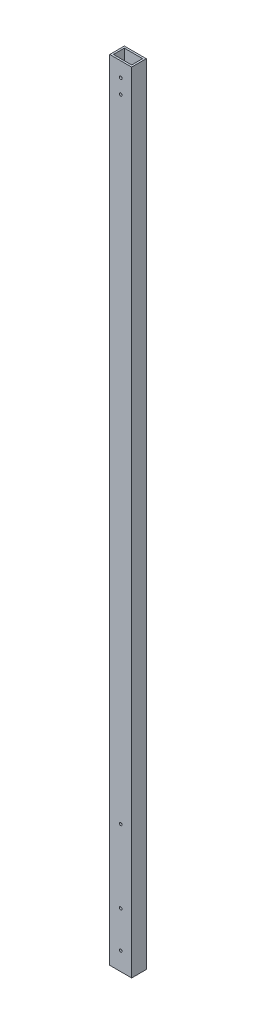
ISO-10303-21;
HEADER;
FILE_DESCRIPTION(('STEP AP214'),'2;1');
FILE_NAME('part.step','',(''),(''),'','','');
FILE_SCHEMA(('AUTOMOTIVE_DESIGN { 1 0 10303 214 1 1 1 1 }'));
ENDSEC;
DATA;
#1=APPLICATION_CONTEXT('core data for automotive mechanical design processes');
#2=APPLICATION_PROTOCOL_DEFINITION('international standard','automotive_design',2000,#1);
#3=PRODUCT_CONTEXT('',#1,'mechanical');
#4=PRODUCT('Part','Part','',(#3));
#5=PRODUCT_RELATED_PRODUCT_CATEGORY('part','',(#4));
#6=PRODUCT_DEFINITION_FORMATION('','',#4);
#7=PRODUCT_DEFINITION_CONTEXT('part definition',#1,'design');
#8=PRODUCT_DEFINITION('design','',#6,#7);
#9=PRODUCT_DEFINITION_SHAPE('','',#8);
#10=(LENGTH_UNIT() NAMED_UNIT(*) SI_UNIT(.MILLI.,.METRE.));
#11=(NAMED_UNIT(*) PLANE_ANGLE_UNIT() SI_UNIT($,.RADIAN.));
#12=(NAMED_UNIT(*) SI_UNIT($,.STERADIAN.) SOLID_ANGLE_UNIT());
#13=UNCERTAINTY_MEASURE_WITH_UNIT(LENGTH_MEASURE(1.E-05),#10,'distance_accuracy_value','');
#14=(GEOMETRIC_REPRESENTATION_CONTEXT(3) GLOBAL_UNCERTAINTY_ASSIGNED_CONTEXT((#13)) GLOBAL_UNIT_ASSIGNED_CONTEXT((#10,
#11,#12)) REPRESENTATION_CONTEXT('',''));
#15=CARTESIAN_POINT('',(0.,0.,0.));
#16=DIRECTION('',(0.,0.,1.));
#17=DIRECTION('',(1.,0.,0.));
#18=AXIS2_PLACEMENT_3D('',#15,#16,#17);
#19=CARTESIAN_POINT('',(0.,1371.6,0.));
#20=DIRECTION('',(0.,-1.,0.));
#21=DIRECTION('',(0.,0.,-1.));
#22=AXIS2_PLACEMENT_3D('',#19,#20,#21);
#23=PLANE('',#22);
#24=DIRECTION('',(0.,0.,-1.));
#25=VECTOR('',#24,1.);
#26=CARTESIAN_POINT('',(19.05,1371.6,12.7));
#27=LINE('',#26,#25);
#28=CARTESIAN_POINT('',(19.05,1371.6,12.7));
#29=VERTEX_POINT('',#28);
#30=CARTESIAN_POINT('',(19.05,1371.6,-12.7));
#31=VERTEX_POINT('',#30);
#32=EDGE_CURVE('E146',#29,#31,#27,.T.);
#33=ORIENTED_EDGE('',*,*,#32,.T.);
#34=DIRECTION('',(-1.,0.,0.));
#35=VECTOR('',#34,1.);
#36=CARTESIAN_POINT('',(-19.05,1371.6,-12.7));
#37=LINE('',#36,#35);
#38=CARTESIAN_POINT('',(-19.05,1371.6,-12.7));
#39=VERTEX_POINT('',#38);
#40=EDGE_CURVE('E149',#31,#39,#37,.T.);
#41=ORIENTED_EDGE('',*,*,#40,.T.);
#42=DIRECTION('',(0.,0.,1.));
#43=VECTOR('',#42,1.);
#44=CARTESIAN_POINT('',(-19.05,1371.6,12.7));
#45=LINE('',#44,#43);
#46=CARTESIAN_POINT('',(-19.05,1371.6,12.7));
#47=VERTEX_POINT('',#46);
#48=EDGE_CURVE('E152',#39,#47,#45,.T.);
#49=ORIENTED_EDGE('',*,*,#48,.T.);
#50=DIRECTION('',(1.,0.,0.));
#51=VECTOR('',#50,1.);
#52=CARTESIAN_POINT('',(-19.05,1371.6,12.7));
#53=LINE('',#52,#51);
#54=EDGE_CURVE('E154',#47,#29,#53,.T.);
#55=ORIENTED_EDGE('',*,*,#54,.T.);
#56=EDGE_LOOP('',(#33,#41,#49,#55));
#57=FACE_BOUND('',#56,.T.);
#58=DIRECTION('',(0.,0.,1.));
#59=VECTOR('',#58,1.);
#60=CARTESIAN_POINT('',(-15.875,1371.6,9.525));
#61=LINE('',#60,#59);
#62=CARTESIAN_POINT('',(-15.875,1371.6,-9.525));
#63=VERTEX_POINT('',#62);
#64=CARTESIAN_POINT('',(-15.875,1371.6,9.525));
#65=VERTEX_POINT('',#64);
#66=EDGE_CURVE('E108',#63,#65,#61,.T.);
#67=ORIENTED_EDGE('',*,*,#66,.F.);
#68=DIRECTION('',(-1.,0.,0.));
#69=VECTOR('',#68,1.);
#70=CARTESIAN_POINT('',(15.875,1371.6,-9.525));
#71=LINE('',#70,#69);
#72=CARTESIAN_POINT('',(15.875,1371.6,-9.525));
#73=VERTEX_POINT('',#72);
#74=EDGE_CURVE('E130',#73,#63,#71,.T.);
#75=ORIENTED_EDGE('',*,*,#74,.F.);
#76=DIRECTION('',(0.,0.,-1.));
#77=VECTOR('',#76,1.);
#78=CARTESIAN_POINT('',(15.875,1371.6,9.525));
#79=LINE('',#78,#77);
#80=CARTESIAN_POINT('',(15.875,1371.6,9.525));
#81=VERTEX_POINT('',#80);
#82=EDGE_CURVE('E128',#81,#73,#79,.T.);
#83=ORIENTED_EDGE('',*,*,#82,.F.);
#84=DIRECTION('',(1.,0.,0.));
#85=VECTOR('',#84,1.);
#86=CARTESIAN_POINT('',(15.875,1371.6,9.525));
#87=LINE('',#86,#85);
#88=EDGE_CURVE('E116',#65,#81,#87,.T.);
#89=ORIENTED_EDGE('',*,*,#88,.F.);
#90=EDGE_LOOP('',(#67,#75,#83,#89));
#91=FACE_BOUND('',#90,.T.);
#92=ADVANCED_FACE('F41',(#57,#91),#23,.F.);
#93=CARTESIAN_POINT('',(0.,0.,0.));
#94=DIRECTION('',(0.,-1.,0.));
#95=DIRECTION('',(0.,0.,-1.));
#96=AXIS2_PLACEMENT_3D('',#93,#94,#95);
#97=PLANE('',#96);
#98=DIRECTION('',(0.,0.,-1.));
#99=VECTOR('',#98,1.);
#100=CARTESIAN_POINT('',(19.05,0.,12.7));
#101=LINE('',#100,#99);
#102=CARTESIAN_POINT('',(19.05,0.,12.7));
#103=VERTEX_POINT('',#102);
#104=CARTESIAN_POINT('',(19.05,0.,-12.7));
#105=VERTEX_POINT('',#104);
#106=EDGE_CURVE('E124',#103,#105,#101,.T.);
#107=ORIENTED_EDGE('',*,*,#106,.F.);
#108=DIRECTION('',(1.,0.,0.));
#109=VECTOR('',#108,1.);
#110=CARTESIAN_POINT('',(-19.05,0.,12.7));
#111=LINE('',#110,#109);
#112=CARTESIAN_POINT('',(-19.05,0.,12.7));
#113=VERTEX_POINT('',#112);
#114=EDGE_CURVE('E150',#113,#103,#111,.T.);
#115=ORIENTED_EDGE('',*,*,#114,.F.);
#116=DIRECTION('',(0.,0.,1.));
#117=VECTOR('',#116,1.);
#118=CARTESIAN_POINT('',(-19.05,0.,12.7));
#119=LINE('',#118,#117);
#120=CARTESIAN_POINT('',(-19.05,0.,-12.7));
#121=VERTEX_POINT('',#120);
#122=EDGE_CURVE('E161',#121,#113,#119,.T.);
#123=ORIENTED_EDGE('',*,*,#122,.F.);
#124=DIRECTION('',(-1.,0.,0.));
#125=VECTOR('',#124,1.);
#126=CARTESIAN_POINT('',(-19.05,0.,-12.7));
#127=LINE('',#126,#125);
#128=EDGE_CURVE('E159',#105,#121,#127,.T.);
#129=ORIENTED_EDGE('',*,*,#128,.F.);
#130=EDGE_LOOP('',(#107,#115,#123,#129));
#131=FACE_BOUND('',#130,.T.);
#132=DIRECTION('',(-1.,0.,0.));
#133=VECTOR('',#132,1.);
#134=CARTESIAN_POINT('',(15.875,0.,-9.525));
#135=LINE('',#134,#133);
#136=CARTESIAN_POINT('',(15.875,0.,-9.525));
#137=VERTEX_POINT('',#136);
#138=CARTESIAN_POINT('',(-15.875,0.,-9.525));
#139=VERTEX_POINT('',#138);
#140=EDGE_CURVE('E117',#137,#139,#135,.T.);
#141=ORIENTED_EDGE('',*,*,#140,.T.);
#142=DIRECTION('',(0.,0.,1.));
#143=VECTOR('',#142,1.);
#144=CARTESIAN_POINT('',(-15.875,0.,9.525));
#145=LINE('',#144,#143);
#146=CARTESIAN_POINT('',(-15.875,0.,9.525));
#147=VERTEX_POINT('',#146);
#148=EDGE_CURVE('E66',#139,#147,#145,.T.);
#149=ORIENTED_EDGE('',*,*,#148,.T.);
#150=DIRECTION('',(1.,0.,0.));
#151=VECTOR('',#150,1.);
#152=CARTESIAN_POINT('',(15.875,0.,9.525));
#153=LINE('',#152,#151);
#154=CARTESIAN_POINT('',(15.875,0.,9.525));
#155=VERTEX_POINT('',#154);
#156=EDGE_CURVE('E123',#147,#155,#153,.T.);
#157=ORIENTED_EDGE('',*,*,#156,.T.);
#158=DIRECTION('',(0.,0.,-1.));
#159=VECTOR('',#158,1.);
#160=CARTESIAN_POINT('',(15.875,0.,9.525));
#161=LINE('',#160,#159);
#162=EDGE_CURVE('E138',#155,#137,#161,.T.);
#163=ORIENTED_EDGE('',*,*,#162,.T.);
#164=EDGE_LOOP('',(#141,#149,#157,#163));
#165=FACE_BOUND('',#164,.T.);
#166=ADVANCED_FACE('F267',(#131,#165),#97,.T.);
#167=CARTESIAN_POINT('',(19.05,1371.6,12.7));
#168=DIRECTION('',(-1.,0.,0.));
#169=DIRECTION('',(0.,0.,1.));
#170=AXIS2_PLACEMENT_3D('',#167,#168,#169);
#171=PLANE('',#170);
#172=ORIENTED_EDGE('',*,*,#106,.T.);
#173=DIRECTION('',(0.,-1.,0.));
#174=VECTOR('',#173,1.);
#175=CARTESIAN_POINT('',(19.05,1371.6,-12.7));
#176=LINE('',#175,#174);
#177=EDGE_CURVE('E11',#31,#105,#176,.T.);
#178=ORIENTED_EDGE('',*,*,#177,.F.);
#179=ORIENTED_EDGE('',*,*,#32,.F.);
#180=DIRECTION('',(0.,-1.,0.));
#181=VECTOR('',#180,1.);
#182=CARTESIAN_POINT('',(19.05,1371.6,12.7));
#183=LINE('',#182,#181);
#184=EDGE_CURVE('E156',#29,#103,#183,.T.);
#185=ORIENTED_EDGE('',*,*,#184,.T.);
#186=EDGE_LOOP('',(#172,#178,#179,#185));
#187=FACE_BOUND('',#186,.T.);
#188=ADVANCED_FACE('F43',(#187),#171,.F.);
#189=CARTESIAN_POINT('',(-19.05,1371.6,-12.7));
#190=DIRECTION('',(0.,0.,1.));
#191=DIRECTION('',(1.,0.,0.));
#192=AXIS2_PLACEMENT_3D('',#189,#190,#191);
#193=PLANE('',#192);
#194=CARTESIAN_POINT('',(0.,1346.2,-12.7));
#195=DIRECTION('',(0.,0.,1.));
#196=DIRECTION('',(1.,0.,0.));
#197=AXIS2_PLACEMENT_3D('',#194,#195,#196);
#198=CIRCLE('',#197,2.41300000000001);
#199=CARTESIAN_POINT('',(2.41300000000001,1346.2,-12.7));
#200=VERTEX_POINT('',#199);
#201=EDGE_CURVE('E185',#200,#200,#198,.F.);
#202=ORIENTED_EDGE('',*,*,#201,.F.);
#203=EDGE_LOOP('',(#202));
#204=FACE_BOUND('',#203,.T.);
#205=CARTESIAN_POINT('',(0.,1320.8,-12.7));
#206=DIRECTION('',(0.,0.,1.));
#207=DIRECTION('',(1.,0.,0.));
#208=AXIS2_PLACEMENT_3D('',#205,#206,#207);
#209=CIRCLE('',#208,2.41300000000001);
#210=CARTESIAN_POINT('',(2.41300000000001,1320.8,-12.7));
#211=VERTEX_POINT('',#210);
#212=EDGE_CURVE('E196',#211,#211,#209,.F.);
#213=ORIENTED_EDGE('',*,*,#212,.F.);
#214=EDGE_LOOP('',(#213));
#215=FACE_BOUND('',#214,.T.);
#216=CARTESIAN_POINT('',(0.,31.75,-12.7));
#217=DIRECTION('',(0.,0.,1.));
#218=DIRECTION('',(1.,0.,0.));
#219=AXIS2_PLACEMENT_3D('',#216,#217,#218);
#220=CIRCLE('',#219,2.413);
#221=CARTESIAN_POINT('',(2.41299999999999,31.75,-12.7));
#222=VERTEX_POINT('',#221);
#223=EDGE_CURVE('E175',#222,#222,#220,.F.);
#224=ORIENTED_EDGE('',*,*,#223,.F.);
#225=EDGE_LOOP('',(#224));
#226=FACE_BOUND('',#225,.T.);
#227=CARTESIAN_POINT('',(0.,222.25,-12.7));
#228=DIRECTION('',(0.,0.,1.));
#229=DIRECTION('',(1.,0.,0.));
#230=AXIS2_PLACEMENT_3D('',#227,#228,#229);
#231=CIRCLE('',#230,2.41300000000001);
#232=CARTESIAN_POINT('',(2.413,222.25,-12.7));
#233=VERTEX_POINT('',#232);
#234=EDGE_CURVE('E211',#233,#233,#231,.F.);
#235=ORIENTED_EDGE('',*,*,#234,.F.);
#236=EDGE_LOOP('',(#235));
#237=FACE_BOUND('',#236,.T.);
#238=CARTESIAN_POINT('',(0.,95.25,-12.7));
#239=DIRECTION('',(0.,0.,1.));
#240=DIRECTION('',(1.,0.,0.));
#241=AXIS2_PLACEMENT_3D('',#238,#239,#240);
#242=CIRCLE('',#241,2.413);
#243=CARTESIAN_POINT('',(2.41299999999999,95.25,-12.7));
#244=VERTEX_POINT('',#243);
#245=EDGE_CURVE('E217',#244,#244,#242,.F.);
#246=ORIENTED_EDGE('',*,*,#245,.F.);
#247=EDGE_LOOP('',(#246));
#248=FACE_BOUND('',#247,.T.);
#249=ORIENTED_EDGE('',*,*,#128,.T.);
#250=DIRECTION('',(0.,-1.,0.));
#251=VECTOR('',#250,1.);
#252=CARTESIAN_POINT('',(-19.05,1371.6,-12.7));
#253=LINE('',#252,#251);
#254=EDGE_CURVE('E50',#39,#121,#253,.T.);
#255=ORIENTED_EDGE('',*,*,#254,.F.);
#256=ORIENTED_EDGE('',*,*,#40,.F.);
#257=ORIENTED_EDGE('',*,*,#177,.T.);
#258=EDGE_LOOP('',(#249,#255,#256,#257));
#259=FACE_BOUND('',#258,.T.);
#260=ADVANCED_FACE('F271',(#204,#215,#226,#237,#248,#259),#193,.F.);
#261=CARTESIAN_POINT('',(-19.05,1371.6,12.7));
#262=DIRECTION('',(1.,0.,0.));
#263=DIRECTION('',(0.,0.,-1.));
#264=AXIS2_PLACEMENT_3D('',#261,#262,#263);
#265=PLANE('',#264);
#266=ORIENTED_EDGE('',*,*,#122,.T.);
#267=DIRECTION('',(0.,-1.,0.));
#268=VECTOR('',#267,1.);
#269=CARTESIAN_POINT('',(-19.05,1371.6,12.7));
#270=LINE('',#269,#268);
#271=EDGE_CURVE('E166',#47,#113,#270,.T.);
#272=ORIENTED_EDGE('',*,*,#271,.F.);
#273=ORIENTED_EDGE('',*,*,#48,.F.);
#274=ORIENTED_EDGE('',*,*,#254,.T.);
#275=EDGE_LOOP('',(#266,#272,#273,#274));
#276=FACE_BOUND('',#275,.T.);
#277=ADVANCED_FACE('F254',(#276),#265,.F.);
#278=CARTESIAN_POINT('',(-19.05,1371.6,12.7));
#279=DIRECTION('',(0.,0.,-1.));
#280=DIRECTION('',(-1.,0.,0.));
#281=AXIS2_PLACEMENT_3D('',#278,#279,#280);
#282=PLANE('',#281);
#283=CARTESIAN_POINT('',(0.,1346.2,12.7));
#284=DIRECTION('',(0.,0.,1.));
#285=DIRECTION('',(1.,0.,0.));
#286=AXIS2_PLACEMENT_3D('',#283,#284,#285);
#287=CIRCLE('',#286,2.41300000000001);
#288=CARTESIAN_POINT('',(2.41300000000001,1346.2,12.7));
#289=VERTEX_POINT('',#288);
#290=EDGE_CURVE('E191',#289,#289,#287,.T.);
#291=ORIENTED_EDGE('',*,*,#290,.F.);
#292=EDGE_LOOP('',(#291));
#293=FACE_BOUND('',#292,.T.);
#294=CARTESIAN_POINT('',(0.,1320.8,12.7));
#295=DIRECTION('',(0.,0.,1.));
#296=DIRECTION('',(1.,0.,0.));
#297=AXIS2_PLACEMENT_3D('',#294,#295,#296);
#298=CIRCLE('',#297,2.41300000000001);
#299=CARTESIAN_POINT('',(2.41300000000001,1320.8,12.7));
#300=VERTEX_POINT('',#299);
#301=EDGE_CURVE('E199',#300,#300,#298,.T.);
#302=ORIENTED_EDGE('',*,*,#301,.F.);
#303=EDGE_LOOP('',(#302));
#304=FACE_BOUND('',#303,.T.);
#305=CARTESIAN_POINT('',(0.,31.75,12.7));
#306=DIRECTION('',(0.,0.,1.));
#307=DIRECTION('',(1.,0.,0.));
#308=AXIS2_PLACEMENT_3D('',#305,#306,#307);
#309=CIRCLE('',#308,2.413);
#310=CARTESIAN_POINT('',(2.41299999999999,31.75,12.7));
#311=VERTEX_POINT('',#310);
#312=EDGE_CURVE('E208',#311,#311,#309,.T.);
#313=ORIENTED_EDGE('',*,*,#312,.F.);
#314=EDGE_LOOP('',(#313));
#315=FACE_BOUND('',#314,.T.);
#316=CARTESIAN_POINT('',(0.,222.25,12.7));
#317=DIRECTION('',(0.,0.,1.));
#318=DIRECTION('',(1.,0.,0.));
#319=AXIS2_PLACEMENT_3D('',#316,#317,#318);
#320=CIRCLE('',#319,2.41300000000001);
#321=CARTESIAN_POINT('',(2.413,222.25,12.7));
#322=VERTEX_POINT('',#321);
#323=EDGE_CURVE('E214',#322,#322,#320,.T.);
#324=ORIENTED_EDGE('',*,*,#323,.F.);
#325=EDGE_LOOP('',(#324));
#326=FACE_BOUND('',#325,.T.);
#327=CARTESIAN_POINT('',(0.,95.25,12.7));
#328=DIRECTION('',(0.,0.,1.));
#329=DIRECTION('',(1.,0.,0.));
#330=AXIS2_PLACEMENT_3D('',#327,#328,#329);
#331=CIRCLE('',#330,2.413);
#332=CARTESIAN_POINT('',(2.41299999999999,95.25,12.7));
#333=VERTEX_POINT('',#332);
#334=EDGE_CURVE('E207',#333,#333,#331,.T.);
#335=ORIENTED_EDGE('',*,*,#334,.F.);
#336=EDGE_LOOP('',(#335));
#337=FACE_BOUND('',#336,.T.);
#338=ORIENTED_EDGE('',*,*,#114,.T.);
#339=ORIENTED_EDGE('',*,*,#184,.F.);
#340=ORIENTED_EDGE('',*,*,#54,.F.);
#341=ORIENTED_EDGE('',*,*,#271,.T.);
#342=EDGE_LOOP('',(#338,#339,#340,#341));
#343=FACE_BOUND('',#342,.T.);
#344=ADVANCED_FACE('F251',(#293,#304,#315,#326,#337,#343),#282,.F.);
#345=CARTESIAN_POINT('',(-15.875,1371.6,9.525));
#346=DIRECTION('',(1.,0.,0.));
#347=DIRECTION('',(0.,0.,-1.));
#348=AXIS2_PLACEMENT_3D('',#345,#346,#347);
#349=PLANE('',#348);
#350=ORIENTED_EDGE('',*,*,#148,.F.);
#351=DIRECTION('',(0.,-1.,0.));
#352=VECTOR('',#351,1.);
#353=CARTESIAN_POINT('',(-15.875,1371.6,-9.525));
#354=LINE('',#353,#352);
#355=EDGE_CURVE('E112',#63,#139,#354,.T.);
#356=ORIENTED_EDGE('',*,*,#355,.F.);
#357=ORIENTED_EDGE('',*,*,#66,.T.);
#358=DIRECTION('',(0.,-1.,0.));
#359=VECTOR('',#358,1.);
#360=CARTESIAN_POINT('',(-15.875,1371.6,9.525));
#361=LINE('',#360,#359);
#362=EDGE_CURVE('E111',#65,#147,#361,.T.);
#363=ORIENTED_EDGE('',*,*,#362,.T.);
#364=EDGE_LOOP('',(#350,#356,#357,#363));
#365=FACE_BOUND('',#364,.T.);
#366=ADVANCED_FACE('F110',(#365),#349,.T.);
#367=CARTESIAN_POINT('',(15.875,1371.6,9.525));
#368=DIRECTION('',(0.,0.,-1.));
#369=DIRECTION('',(-1.,0.,0.));
#370=AXIS2_PLACEMENT_3D('',#367,#368,#369);
#371=PLANE('',#370);
#372=CARTESIAN_POINT('',(0.,1346.2,9.525));
#373=DIRECTION('',(0.,0.,-1.));
#374=DIRECTION('',(-1.,0.,0.));
#375=AXIS2_PLACEMENT_3D('',#372,#373,#374);
#376=CIRCLE('',#375,2.41300000000001);
#377=CARTESIAN_POINT('',(-2.413,1346.2,9.525));
#378=VERTEX_POINT('',#377);
#379=EDGE_CURVE('E204',#378,#378,#376,.T.);
#380=ORIENTED_EDGE('',*,*,#379,.F.);
#381=EDGE_LOOP('',(#380));
#382=FACE_BOUND('',#381,.T.);
#383=CARTESIAN_POINT('',(0.,1320.8,9.525));
#384=DIRECTION('',(0.,0.,-1.));
#385=DIRECTION('',(-1.,0.,0.));
#386=AXIS2_PLACEMENT_3D('',#383,#384,#385);
#387=CIRCLE('',#386,2.41300000000001);
#388=CARTESIAN_POINT('',(-2.413,1320.8,9.525));
#389=VERTEX_POINT('',#388);
#390=EDGE_CURVE('E184',#389,#389,#387,.T.);
#391=ORIENTED_EDGE('',*,*,#390,.F.);
#392=EDGE_LOOP('',(#391));
#393=FACE_BOUND('',#392,.T.);
#394=CARTESIAN_POINT('',(0.,31.75,9.525));
#395=DIRECTION('',(0.,0.,-1.));
#396=DIRECTION('',(-1.,0.,0.));
#397=AXIS2_PLACEMENT_3D('',#394,#395,#396);
#398=CIRCLE('',#397,2.413);
#399=CARTESIAN_POINT('',(-2.41300000000001,31.75,9.525));
#400=VERTEX_POINT('',#399);
#401=EDGE_CURVE('E136',#400,#400,#398,.T.);
#402=ORIENTED_EDGE('',*,*,#401,.F.);
#403=EDGE_LOOP('',(#402));
#404=FACE_BOUND('',#403,.T.);
#405=CARTESIAN_POINT('',(0.,222.25,9.525));
#406=DIRECTION('',(0.,0.,-1.));
#407=DIRECTION('',(-1.,0.,0.));
#408=AXIS2_PLACEMENT_3D('',#405,#406,#407);
#409=CIRCLE('',#408,2.41300000000001);
#410=CARTESIAN_POINT('',(-2.41300000000002,222.25,9.525));
#411=VERTEX_POINT('',#410);
#412=EDGE_CURVE('E179',#411,#411,#409,.T.);
#413=ORIENTED_EDGE('',*,*,#412,.F.);
#414=EDGE_LOOP('',(#413));
#415=FACE_BOUND('',#414,.T.);
#416=CARTESIAN_POINT('',(0.,95.25,9.525));
#417=DIRECTION('',(0.,0.,-1.));
#418=DIRECTION('',(-1.,0.,0.));
#419=AXIS2_PLACEMENT_3D('',#416,#417,#418);
#420=CIRCLE('',#419,2.413);
#421=CARTESIAN_POINT('',(-2.41300000000001,95.25,9.525));
#422=VERTEX_POINT('',#421);
#423=EDGE_CURVE('E174',#422,#422,#420,.T.);
#424=ORIENTED_EDGE('',*,*,#423,.F.);
#425=EDGE_LOOP('',(#424));
#426=FACE_BOUND('',#425,.T.);
#427=ORIENTED_EDGE('',*,*,#156,.F.);
#428=ORIENTED_EDGE('',*,*,#362,.F.);
#429=ORIENTED_EDGE('',*,*,#88,.T.);
#430=DIRECTION('',(0.,-1.,0.));
#431=VECTOR('',#430,1.);
#432=CARTESIAN_POINT('',(15.875,1371.6,9.525));
#433=LINE('',#432,#431);
#434=EDGE_CURVE('E125',#81,#155,#433,.T.);
#435=ORIENTED_EDGE('',*,*,#434,.T.);
#436=EDGE_LOOP('',(#427,#428,#429,#435));
#437=FACE_BOUND('',#436,.T.);
#438=ADVANCED_FACE('F120',(#382,#393,#404,#415,#426,#437),#371,.T.);
#439=CARTESIAN_POINT('',(15.875,1371.6,9.525));
#440=DIRECTION('',(-1.,0.,0.));
#441=DIRECTION('',(0.,0.,1.));
#442=AXIS2_PLACEMENT_3D('',#439,#440,#441);
#443=PLANE('',#442);
#444=ORIENTED_EDGE('',*,*,#162,.F.);
#445=ORIENTED_EDGE('',*,*,#434,.F.);
#446=ORIENTED_EDGE('',*,*,#82,.T.);
#447=DIRECTION('',(0.,-1.,0.));
#448=VECTOR('',#447,1.);
#449=CARTESIAN_POINT('',(15.875,1371.6,-9.525));
#450=LINE('',#449,#448);
#451=EDGE_CURVE('E58',#73,#137,#450,.T.);
#452=ORIENTED_EDGE('',*,*,#451,.T.);
#453=EDGE_LOOP('',(#444,#445,#446,#452));
#454=FACE_BOUND('',#453,.T.);
#455=ADVANCED_FACE('F235',(#454),#443,.T.);
#456=CARTESIAN_POINT('',(15.875,1371.6,-9.525));
#457=DIRECTION('',(0.,0.,1.));
#458=DIRECTION('',(1.,0.,0.));
#459=AXIS2_PLACEMENT_3D('',#456,#457,#458);
#460=PLANE('',#459);
#461=CARTESIAN_POINT('',(0.,1346.2,-9.525));
#462=DIRECTION('',(0.,0.,1.));
#463=DIRECTION('',(1.,0.,0.));
#464=AXIS2_PLACEMENT_3D('',#461,#462,#463);
#465=CIRCLE('',#464,2.41300000000001);
#466=CARTESIAN_POINT('',(2.41300000000001,1346.2,-9.525));
#467=VERTEX_POINT('',#466);
#468=EDGE_CURVE('E45',#467,#467,#465,.T.);
#469=ORIENTED_EDGE('',*,*,#468,.F.);
#470=EDGE_LOOP('',(#469));
#471=FACE_BOUND('',#470,.T.);
#472=CARTESIAN_POINT('',(0.,1320.8,-9.525));
#473=DIRECTION('',(0.,0.,1.));
#474=DIRECTION('',(1.,0.,0.));
#475=AXIS2_PLACEMENT_3D('',#472,#473,#474);
#476=CIRCLE('',#475,2.41300000000001);
#477=CARTESIAN_POINT('',(2.41300000000001,1320.8,-9.525));
#478=VERTEX_POINT('',#477);
#479=EDGE_CURVE('E182',#478,#478,#476,.T.);
#480=ORIENTED_EDGE('',*,*,#479,.F.);
#481=EDGE_LOOP('',(#480));
#482=FACE_BOUND('',#481,.T.);
#483=CARTESIAN_POINT('',(0.,31.75,-9.525));
#484=DIRECTION('',(0.,0.,1.));
#485=DIRECTION('',(1.,0.,0.));
#486=AXIS2_PLACEMENT_3D('',#483,#484,#485);
#487=CIRCLE('',#486,2.413);
#488=CARTESIAN_POINT('',(2.41299999999999,31.75,-9.525));
#489=VERTEX_POINT('',#488);
#490=EDGE_CURVE('E180',#489,#489,#487,.T.);
#491=ORIENTED_EDGE('',*,*,#490,.F.);
#492=EDGE_LOOP('',(#491));
#493=FACE_BOUND('',#492,.T.);
#494=CARTESIAN_POINT('',(0.,222.25,-9.525));
#495=DIRECTION('',(0.,0.,1.));
#496=DIRECTION('',(1.,0.,0.));
#497=AXIS2_PLACEMENT_3D('',#494,#495,#496);
#498=CIRCLE('',#497,2.41300000000001);
#499=CARTESIAN_POINT('',(2.413,222.25,-9.525));
#500=VERTEX_POINT('',#499);
#501=EDGE_CURVE('E176',#500,#500,#498,.T.);
#502=ORIENTED_EDGE('',*,*,#501,.F.);
#503=EDGE_LOOP('',(#502));
#504=FACE_BOUND('',#503,.T.);
#505=CARTESIAN_POINT('',(0.,95.25,-9.525));
#506=DIRECTION('',(0.,0.,1.));
#507=DIRECTION('',(1.,0.,0.));
#508=AXIS2_PLACEMENT_3D('',#505,#506,#507);
#509=CIRCLE('',#508,2.413);
#510=CARTESIAN_POINT('',(2.41299999999999,95.25,-9.525));
#511=VERTEX_POINT('',#510);
#512=EDGE_CURVE('E171',#511,#511,#509,.T.);
#513=ORIENTED_EDGE('',*,*,#512,.F.);
#514=EDGE_LOOP('',(#513));
#515=FACE_BOUND('',#514,.T.);
#516=ORIENTED_EDGE('',*,*,#140,.F.);
#517=ORIENTED_EDGE('',*,*,#451,.F.);
#518=ORIENTED_EDGE('',*,*,#74,.T.);
#519=ORIENTED_EDGE('',*,*,#355,.T.);
#520=EDGE_LOOP('',(#516,#517,#518,#519));
#521=FACE_BOUND('',#520,.T.);
#522=ADVANCED_FACE('F293',(#471,#482,#493,#504,#515,#521),#460,.T.);
#523=CARTESIAN_POINT('',(0.,95.25,-19.5249946520126));
#524=DIRECTION('',(0.,0.,1.));
#525=DIRECTION('',(1.,0.,0.));
#526=AXIS2_PLACEMENT_3D('',#523,#524,#525);
#527=CYLINDRICAL_SURFACE('',#526,2.413);
#528=ORIENTED_EDGE('',*,*,#512,.T.);
#529=EDGE_LOOP('',(#528));
#530=FACE_BOUND('',#529,.T.);
#531=ORIENTED_EDGE('',*,*,#245,.T.);
#532=EDGE_LOOP('',(#531));
#533=FACE_BOUND('',#532,.T.);
#534=ADVANCED_FACE('F248',(#530,#533),#527,.F.);
#535=CARTESIAN_POINT('',(0.,222.25,-19.5249946520126));
#536=DIRECTION('',(0.,0.,1.));
#537=DIRECTION('',(1.,0.,0.));
#538=AXIS2_PLACEMENT_3D('',#535,#536,#537);
#539=CYLINDRICAL_SURFACE('',#538,2.41300000000001);
#540=ORIENTED_EDGE('',*,*,#501,.T.);
#541=EDGE_LOOP('',(#540));
#542=FACE_BOUND('',#541,.T.);
#543=ORIENTED_EDGE('',*,*,#234,.T.);
#544=EDGE_LOOP('',(#543));
#545=FACE_BOUND('',#544,.T.);
#546=ADVANCED_FACE('F299',(#542,#545),#539,.F.);
#547=CARTESIAN_POINT('',(0.,31.75,-19.5249946520126));
#548=DIRECTION('',(0.,0.,1.));
#549=DIRECTION('',(1.,0.,0.));
#550=AXIS2_PLACEMENT_3D('',#547,#548,#549);
#551=CYLINDRICAL_SURFACE('',#550,2.413);
#552=ORIENTED_EDGE('',*,*,#490,.T.);
#553=EDGE_LOOP('',(#552));
#554=FACE_BOUND('',#553,.T.);
#555=ORIENTED_EDGE('',*,*,#223,.T.);
#556=EDGE_LOOP('',(#555));
#557=FACE_BOUND('',#556,.T.);
#558=ADVANCED_FACE('F246',(#554,#557),#551,.F.);
#559=ORIENTED_EDGE('',*,*,#423,.T.);
#560=EDGE_LOOP('',(#559));
#561=FACE_BOUND('',#560,.T.);
#562=ORIENTED_EDGE('',*,*,#334,.T.);
#563=EDGE_LOOP('',(#562));
#564=FACE_BOUND('',#563,.T.);
#565=ADVANCED_FACE('F242',(#561,#564),#527,.F.);
#566=ORIENTED_EDGE('',*,*,#412,.T.);
#567=EDGE_LOOP('',(#566));
#568=FACE_BOUND('',#567,.T.);
#569=ORIENTED_EDGE('',*,*,#323,.T.);
#570=EDGE_LOOP('',(#569));
#571=FACE_BOUND('',#570,.T.);
#572=ADVANCED_FACE('F245',(#568,#571),#539,.F.);
#573=ORIENTED_EDGE('',*,*,#401,.T.);
#574=EDGE_LOOP('',(#573));
#575=FACE_BOUND('',#574,.T.);
#576=ORIENTED_EDGE('',*,*,#312,.T.);
#577=EDGE_LOOP('',(#576));
#578=FACE_BOUND('',#577,.T.);
#579=ADVANCED_FACE('F230',(#575,#578),#551,.F.);
#580=CARTESIAN_POINT('',(0.,1320.8,-19.5249946520126));
#581=DIRECTION('',(0.,0.,1.));
#582=DIRECTION('',(1.,0.,0.));
#583=AXIS2_PLACEMENT_3D('',#580,#581,#582);
#584=CYLINDRICAL_SURFACE('',#583,2.41300000000001);
#585=ORIENTED_EDGE('',*,*,#479,.T.);
#586=EDGE_LOOP('',(#585));
#587=FACE_BOUND('',#586,.T.);
#588=ORIENTED_EDGE('',*,*,#212,.T.);
#589=EDGE_LOOP('',(#588));
#590=FACE_BOUND('',#589,.T.);
#591=ADVANCED_FACE('F307',(#587,#590),#584,.F.);
#592=CARTESIAN_POINT('',(0.,1346.2,-19.5249946520126));
#593=DIRECTION('',(0.,0.,1.));
#594=DIRECTION('',(1.,0.,0.));
#595=AXIS2_PLACEMENT_3D('',#592,#593,#594);
#596=CYLINDRICAL_SURFACE('',#595,2.41300000000001);
#597=ORIENTED_EDGE('',*,*,#468,.T.);
#598=EDGE_LOOP('',(#597));
#599=FACE_BOUND('',#598,.T.);
#600=ORIENTED_EDGE('',*,*,#201,.T.);
#601=EDGE_LOOP('',(#600));
#602=FACE_BOUND('',#601,.T.);
#603=ADVANCED_FACE('F310',(#599,#602),#596,.F.);
#604=ORIENTED_EDGE('',*,*,#390,.T.);
#605=EDGE_LOOP('',(#604));
#606=FACE_BOUND('',#605,.T.);
#607=ORIENTED_EDGE('',*,*,#301,.T.);
#608=EDGE_LOOP('',(#607));
#609=FACE_BOUND('',#608,.T.);
#610=ADVANCED_FACE('F311',(#606,#609),#584,.F.);
#611=ORIENTED_EDGE('',*,*,#379,.T.);
#612=EDGE_LOOP('',(#611));
#613=FACE_BOUND('',#612,.T.);
#614=ORIENTED_EDGE('',*,*,#290,.T.);
#615=EDGE_LOOP('',(#614));
#616=FACE_BOUND('',#615,.T.);
#617=ADVANCED_FACE('F314',(#613,#616),#596,.F.);
#618=CLOSED_SHELL('',(#92,#166,#188,#260,#277,#344,#366,#438,#455,#522,#534,#546,#558,#565,#572,
#579,#591,#603,#610,#617));
#619=MANIFOLD_SOLID_BREP('B2',#618);
#620=ADVANCED_BREP_SHAPE_REPRESENTATION('',(#18,#619),#14);
#621=SHAPE_DEFINITION_REPRESENTATION(#9,#620);
ENDSEC;
END-ISO-10303-21;
